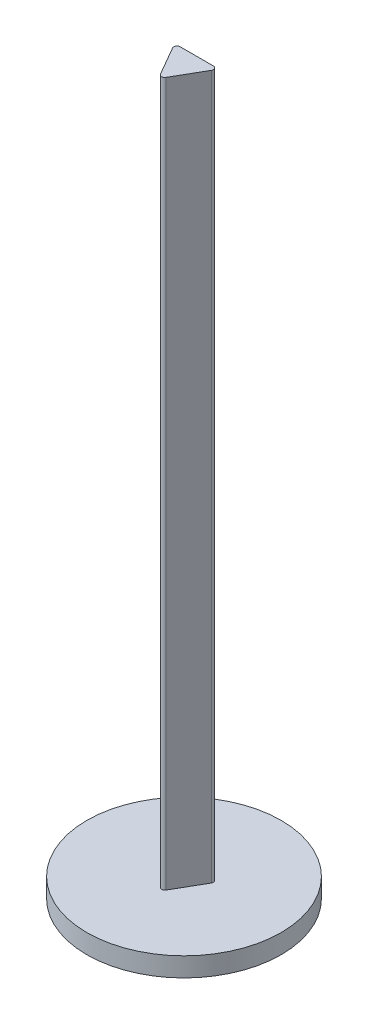
ISO-10303-21;
HEADER;
FILE_DESCRIPTION(('STEP AP214'),'2;1');
FILE_NAME('part.step','',(''),(''),'','','');
FILE_SCHEMA(('AUTOMOTIVE_DESIGN { 1 0 10303 214 1 1 1 1 }'));
ENDSEC;
DATA;
#1=APPLICATION_CONTEXT('core data for automotive mechanical design processes');
#2=APPLICATION_PROTOCOL_DEFINITION('international standard','automotive_design',2000,#1);
#3=PRODUCT_CONTEXT('',#1,'mechanical');
#4=PRODUCT('Part','Part','',(#3));
#5=PRODUCT_RELATED_PRODUCT_CATEGORY('part','',(#4));
#6=PRODUCT_DEFINITION_FORMATION('','',#4);
#7=PRODUCT_DEFINITION_CONTEXT('part definition',#1,'design');
#8=PRODUCT_DEFINITION('design','',#6,#7);
#9=PRODUCT_DEFINITION_SHAPE('','',#8);
#10=(LENGTH_UNIT() NAMED_UNIT(*) SI_UNIT(.MILLI.,.METRE.));
#11=(NAMED_UNIT(*) PLANE_ANGLE_UNIT() SI_UNIT($,.RADIAN.));
#12=(NAMED_UNIT(*) SI_UNIT($,.STERADIAN.) SOLID_ANGLE_UNIT());
#13=UNCERTAINTY_MEASURE_WITH_UNIT(LENGTH_MEASURE(1.E-05),#10,'distance_accuracy_value','');
#14=(GEOMETRIC_REPRESENTATION_CONTEXT(3) GLOBAL_UNCERTAINTY_ASSIGNED_CONTEXT((#13)) GLOBAL_UNIT_ASSIGNED_CONTEXT((#10,
#11,#12)) REPRESENTATION_CONTEXT('',''));
#15=CARTESIAN_POINT('',(0.,0.,0.));
#16=DIRECTION('',(0.,0.,1.));
#17=DIRECTION('',(1.,0.,0.));
#18=AXIS2_PLACEMENT_3D('',#15,#16,#17);
#19=CARTESIAN_POINT('',(0.,3.,0.));
#20=DIRECTION('',(0.,1.,0.));
#21=DIRECTION('',(0.,0.,1.));
#22=AXIS2_PLACEMENT_3D('',#19,#20,#21);
#23=PLANE('',#22);
#24=CARTESIAN_POINT('',(0.,3.,0.));
#25=DIRECTION('',(0.,1.,0.));
#26=DIRECTION('',(0.,0.,1.));
#27=AXIS2_PLACEMENT_3D('',#24,#25,#26);
#28=CIRCLE('',#27,15.19);
#29=CARTESIAN_POINT('',(0.,3.,15.19));
#30=VERTEX_POINT('',#29);
#31=EDGE_CURVE('E11',#30,#30,#28,.T.);
#32=ORIENTED_EDGE('',*,*,#31,.T.);
#33=EDGE_LOOP('',(#32));
#34=FACE_BOUND('',#33,.T.);
#35=DIRECTION('',(0.5,0.,-0.866025403784439));
#36=VECTOR('',#35,1.);
#37=CARTESIAN_POINT('',(0.433012701892223,3.,3.25000000000011));
#38=LINE('',#37,#36);
#39=CARTESIAN_POINT('',(0.433012701892223,3.,3.25000000000011));
#40=VERTEX_POINT('',#39);
#41=CARTESIAN_POINT('',(3.03108891324563,3.,-1.25000000000005));
#42=VERTEX_POINT('',#41);
#43=EDGE_CURVE('E122',#40,#42,#38,.T.);
#44=ORIENTED_EDGE('',*,*,#43,.F.);
#45=CARTESIAN_POINT('',(0.,3.,3.00000000000011));
#46=DIRECTION('',(0.,1.,0.));
#47=DIRECTION('',(0.,0.,-1.));
#48=AXIS2_PLACEMENT_3D('',#45,#46,#47);
#49=CIRCLE('',#48,0.5);
#50=CARTESIAN_POINT('',(-0.433012701892223,3.,3.25000000000011));
#51=VERTEX_POINT('',#50);
#52=EDGE_CURVE('E119',#51,#40,#49,.T.);
#53=ORIENTED_EDGE('',*,*,#52,.F.);
#54=DIRECTION('',(0.5,0.,0.866025403784439));
#55=VECTOR('',#54,1.);
#56=CARTESIAN_POINT('',(-3.03108891324563,3.,-1.25000000000005));
#57=LINE('',#56,#55);
#58=CARTESIAN_POINT('',(-3.03108891324563,3.,-1.25000000000005));
#59=VERTEX_POINT('',#58);
#60=EDGE_CURVE('E78',#59,#51,#57,.T.);
#61=ORIENTED_EDGE('',*,*,#60,.F.);
#62=CARTESIAN_POINT('',(-2.59807621135341,3.,-1.50000000000005));
#63=DIRECTION('',(0.,1.,0.));
#64=DIRECTION('',(0.,0.,1.));
#65=AXIS2_PLACEMENT_3D('',#62,#63,#64);
#66=CIRCLE('',#65,0.5);
#67=CARTESIAN_POINT('',(-2.59807621135341,3.,-2.00000000000005));
#68=VERTEX_POINT('',#67);
#69=EDGE_CURVE('E127',#68,#59,#66,.T.);
#70=ORIENTED_EDGE('',*,*,#69,.F.);
#71=DIRECTION('',(-1.,0.,0.));
#72=VECTOR('',#71,1.);
#73=CARTESIAN_POINT('',(2.59807621135341,3.,-2.00000000000006));
#74=LINE('',#73,#72);
#75=CARTESIAN_POINT('',(2.59807621135341,3.,-2.00000000000006));
#76=VERTEX_POINT('',#75);
#77=EDGE_CURVE('E108',#76,#68,#74,.T.);
#78=ORIENTED_EDGE('',*,*,#77,.F.);
#79=CARTESIAN_POINT('',(2.59807621135341,3.,-1.50000000000006));
#80=DIRECTION('',(0.,1.,0.));
#81=DIRECTION('',(0.,0.,1.));
#82=AXIS2_PLACEMENT_3D('',#79,#80,#81);
#83=CIRCLE('',#82,0.5);
#84=EDGE_CURVE('E124',#42,#76,#83,.T.);
#85=ORIENTED_EDGE('',*,*,#84,.F.);
#86=EDGE_LOOP('',(#44,#53,#61,#70,#78,#85));
#87=FACE_BOUND('',#86,.T.);
#88=ADVANCED_FACE('F35',(#34,#87),#23,.T.);
#89=CARTESIAN_POINT('',(0.,3.,0.));
#90=DIRECTION('',(0.,-1.,0.));
#91=DIRECTION('',(0.,0.,-1.));
#92=AXIS2_PLACEMENT_3D('',#89,#90,#91);
#93=CYLINDRICAL_SURFACE('',#92,15.19);
#94=ORIENTED_EDGE('',*,*,#31,.F.);
#95=EDGE_LOOP('',(#94));
#96=FACE_BOUND('',#95,.T.);
#97=CARTESIAN_POINT('',(0.,0.,0.));
#98=DIRECTION('',(0.,1.,0.));
#99=DIRECTION('',(0.,0.,1.));
#100=AXIS2_PLACEMENT_3D('',#97,#98,#99);
#101=CIRCLE('',#100,15.19);
#102=CARTESIAN_POINT('',(0.,0.,15.19));
#103=VERTEX_POINT('',#102);
#104=EDGE_CURVE('E39',#103,#103,#101,.T.);
#105=ORIENTED_EDGE('',*,*,#104,.T.);
#106=EDGE_LOOP('',(#105));
#107=FACE_BOUND('',#106,.T.);
#108=ADVANCED_FACE('F37',(#96,#107),#93,.T.);
#109=CARTESIAN_POINT('',(0.,0.,0.));
#110=DIRECTION('',(0.,1.,0.));
#111=DIRECTION('',(0.,0.,1.));
#112=AXIS2_PLACEMENT_3D('',#109,#110,#111);
#113=PLANE('',#112);
#114=ORIENTED_EDGE('',*,*,#104,.F.);
#115=EDGE_LOOP('',(#114));
#116=FACE_BOUND('',#115,.T.);
#117=ADVANCED_FACE('F143',(#116),#113,.F.);
#118=CARTESIAN_POINT('',(0.,113.,3.00000000000011));
#119=DIRECTION('',(0.,-1.,0.));
#120=DIRECTION('',(0.,0.,-1.));
#121=AXIS2_PLACEMENT_3D('',#118,#119,#120);
#122=CYLINDRICAL_SURFACE('',#121,0.5);
#123=ORIENTED_EDGE('',*,*,#52,.T.);
#124=DIRECTION('',(0.,-1.,0.));
#125=VECTOR('',#124,1.);
#126=CARTESIAN_POINT('',(0.433012701892223,113.,3.25000000000011));
#127=LINE('',#126,#125);
#128=CARTESIAN_POINT('',(0.433012701892223,113.,3.25000000000011));
#129=VERTEX_POINT('',#128);
#130=EDGE_CURVE('E137',#129,#40,#127,.T.);
#131=ORIENTED_EDGE('',*,*,#130,.F.);
#132=CARTESIAN_POINT('',(0.,113.,3.00000000000011));
#133=DIRECTION('',(0.,1.,0.));
#134=DIRECTION('',(0.,0.,-1.));
#135=AXIS2_PLACEMENT_3D('',#132,#133,#134);
#136=CIRCLE('',#135,0.5);
#137=CARTESIAN_POINT('',(-0.433012701892223,113.,3.25000000000011));
#138=VERTEX_POINT('',#137);
#139=EDGE_CURVE('E130',#138,#129,#136,.T.);
#140=ORIENTED_EDGE('',*,*,#139,.F.);
#141=DIRECTION('',(0.,-1.,0.));
#142=VECTOR('',#141,1.);
#143=CARTESIAN_POINT('',(-0.433012701892223,113.,3.25000000000011));
#144=LINE('',#143,#142);
#145=EDGE_CURVE('E115',#138,#51,#144,.T.);
#146=ORIENTED_EDGE('',*,*,#145,.T.);
#147=EDGE_LOOP('',(#123,#131,#140,#146));
#148=FACE_BOUND('',#147,.T.);
#149=ADVANCED_FACE('F145',(#148),#122,.T.);
#150=CARTESIAN_POINT('',(0.433012701892223,113.,3.25000000000011));
#151=DIRECTION('',(-0.866025403784439,0.,-0.5));
#152=DIRECTION('',(-0.5,0.,0.866025403784439));
#153=AXIS2_PLACEMENT_3D('',#150,#151,#152);
#154=PLANE('',#153);
#155=ORIENTED_EDGE('',*,*,#43,.T.);
#156=DIRECTION('',(0.,-1.,0.));
#157=VECTOR('',#156,1.);
#158=CARTESIAN_POINT('',(3.03108891324563,113.,-1.25000000000005));
#159=LINE('',#158,#157);
#160=CARTESIAN_POINT('',(3.03108891324563,113.,-1.25000000000005));
#161=VERTEX_POINT('',#160);
#162=EDGE_CURVE('E134',#161,#42,#159,.T.);
#163=ORIENTED_EDGE('',*,*,#162,.F.);
#164=DIRECTION('',(0.5,0.,-0.866025403784439));
#165=VECTOR('',#164,1.);
#166=CARTESIAN_POINT('',(0.433012701892223,113.,3.25000000000011));
#167=LINE('',#166,#165);
#168=EDGE_CURVE('E86',#129,#161,#167,.T.);
#169=ORIENTED_EDGE('',*,*,#168,.F.);
#170=ORIENTED_EDGE('',*,*,#130,.T.);
#171=EDGE_LOOP('',(#155,#163,#169,#170));
#172=FACE_BOUND('',#171,.T.);
#173=ADVANCED_FACE('F150',(#172),#154,.F.);
#174=CARTESIAN_POINT('',(2.59807621135341,113.,-1.50000000000006));
#175=DIRECTION('',(0.,-1.,0.));
#176=DIRECTION('',(0.,0.,-1.));
#177=AXIS2_PLACEMENT_3D('',#174,#175,#176);
#178=CYLINDRICAL_SURFACE('',#177,0.5);
#179=ORIENTED_EDGE('',*,*,#84,.T.);
#180=DIRECTION('',(0.,-1.,0.));
#181=VECTOR('',#180,1.);
#182=CARTESIAN_POINT('',(2.59807621135341,113.,-2.00000000000006));
#183=LINE('',#182,#181);
#184=CARTESIAN_POINT('',(2.59807621135341,113.,-2.00000000000006));
#185=VERTEX_POINT('',#184);
#186=EDGE_CURVE('E111',#185,#76,#183,.T.);
#187=ORIENTED_EDGE('',*,*,#186,.F.);
#188=CARTESIAN_POINT('',(2.59807621135341,113.,-1.50000000000006));
#189=DIRECTION('',(0.,1.,0.));
#190=DIRECTION('',(0.,0.,1.));
#191=AXIS2_PLACEMENT_3D('',#188,#189,#190);
#192=CIRCLE('',#191,0.5);
#193=EDGE_CURVE('E99',#161,#185,#192,.T.);
#194=ORIENTED_EDGE('',*,*,#193,.F.);
#195=ORIENTED_EDGE('',*,*,#162,.T.);
#196=EDGE_LOOP('',(#179,#187,#194,#195));
#197=FACE_BOUND('',#196,.T.);
#198=ADVANCED_FACE('F163',(#197),#178,.T.);
#199=CARTESIAN_POINT('',(2.59807621135341,113.,-2.00000000000006));
#200=DIRECTION('',(0.,0.,1.));
#201=DIRECTION('',(1.,0.,0.));
#202=AXIS2_PLACEMENT_3D('',#199,#200,#201);
#203=PLANE('',#202);
#204=ORIENTED_EDGE('',*,*,#77,.T.);
#205=DIRECTION('',(0.,-1.,0.));
#206=VECTOR('',#205,1.);
#207=CARTESIAN_POINT('',(-2.59807621135341,113.,-2.00000000000005));
#208=LINE('',#207,#206);
#209=CARTESIAN_POINT('',(-2.59807621135341,113.,-2.00000000000005));
#210=VERTEX_POINT('',#209);
#211=EDGE_CURVE('E105',#210,#68,#208,.T.);
#212=ORIENTED_EDGE('',*,*,#211,.F.);
#213=DIRECTION('',(-1.,0.,0.));
#214=VECTOR('',#213,1.);
#215=CARTESIAN_POINT('',(2.59807621135341,113.,-2.00000000000006));
#216=LINE('',#215,#214);
#217=EDGE_CURVE('E93',#185,#210,#216,.T.);
#218=ORIENTED_EDGE('',*,*,#217,.F.);
#219=ORIENTED_EDGE('',*,*,#186,.T.);
#220=EDGE_LOOP('',(#204,#212,#218,#219));
#221=FACE_BOUND('',#220,.T.);
#222=ADVANCED_FACE('F106',(#221),#203,.F.);
#223=CARTESIAN_POINT('',(-2.59807621135341,113.,-1.50000000000005));
#224=DIRECTION('',(0.,-1.,0.));
#225=DIRECTION('',(0.,0.,-1.));
#226=AXIS2_PLACEMENT_3D('',#223,#224,#225);
#227=CYLINDRICAL_SURFACE('',#226,0.5);
#228=ORIENTED_EDGE('',*,*,#69,.T.);
#229=DIRECTION('',(0.,-1.,0.));
#230=VECTOR('',#229,1.);
#231=CARTESIAN_POINT('',(-3.03108891324563,113.,-1.25000000000005));
#232=LINE('',#231,#230);
#233=CARTESIAN_POINT('',(-3.03108891324563,113.,-1.25000000000005));
#234=VERTEX_POINT('',#233);
#235=EDGE_CURVE('E50',#234,#59,#232,.T.);
#236=ORIENTED_EDGE('',*,*,#235,.F.);
#237=CARTESIAN_POINT('',(-2.59807621135341,113.,-1.50000000000005));
#238=DIRECTION('',(0.,1.,0.));
#239=DIRECTION('',(0.,0.,1.));
#240=AXIS2_PLACEMENT_3D('',#237,#238,#239);
#241=CIRCLE('',#240,0.5);
#242=EDGE_CURVE('E97',#210,#234,#241,.T.);
#243=ORIENTED_EDGE('',*,*,#242,.F.);
#244=ORIENTED_EDGE('',*,*,#211,.T.);
#245=EDGE_LOOP('',(#228,#236,#243,#244));
#246=FACE_BOUND('',#245,.T.);
#247=ADVANCED_FACE('F113',(#246),#227,.T.);
#248=CARTESIAN_POINT('',(-3.03108891324563,113.,-1.25000000000005));
#249=DIRECTION('',(0.866025403784439,0.,-0.5));
#250=DIRECTION('',(-0.5,0.,-0.866025403784438));
#251=AXIS2_PLACEMENT_3D('',#248,#249,#250);
#252=PLANE('',#251);
#253=ORIENTED_EDGE('',*,*,#60,.T.);
#254=ORIENTED_EDGE('',*,*,#145,.F.);
#255=DIRECTION('',(0.5,0.,0.866025403784439));
#256=VECTOR('',#255,1.);
#257=CARTESIAN_POINT('',(-3.03108891324563,113.,-1.25000000000005));
#258=LINE('',#257,#256);
#259=EDGE_CURVE('E58',#234,#138,#258,.T.);
#260=ORIENTED_EDGE('',*,*,#259,.F.);
#261=ORIENTED_EDGE('',*,*,#235,.T.);
#262=EDGE_LOOP('',(#253,#254,#260,#261));
#263=FACE_BOUND('',#262,.T.);
#264=ADVANCED_FACE('F171',(#263),#252,.F.);
#265=CARTESIAN_POINT('',(0.,113.,3.00000000000011));
#266=DIRECTION('',(0.,-1.,0.));
#267=DIRECTION('',(0.,0.,-1.));
#268=AXIS2_PLACEMENT_3D('',#265,#266,#267);
#269=PLANE('',#268);
#270=ORIENTED_EDGE('',*,*,#139,.T.);
#271=ORIENTED_EDGE('',*,*,#168,.T.);
#272=ORIENTED_EDGE('',*,*,#193,.T.);
#273=ORIENTED_EDGE('',*,*,#217,.T.);
#274=ORIENTED_EDGE('',*,*,#242,.T.);
#275=ORIENTED_EDGE('',*,*,#259,.T.);
#276=EDGE_LOOP('',(#270,#271,#272,#273,#274,#275));
#277=FACE_BOUND('',#276,.T.);
#278=ADVANCED_FACE('F95',(#277),#269,.F.);
#279=CLOSED_SHELL('',(#88,#108,#117,#149,#173,#198,#222,#247,#264,#278));
#280=MANIFOLD_SOLID_BREP('B2',#279);
#281=ADVANCED_BREP_SHAPE_REPRESENTATION('',(#18,#280),#14);
#282=SHAPE_DEFINITION_REPRESENTATION(#9,#281);
ENDSEC;
END-ISO-10303-21;
